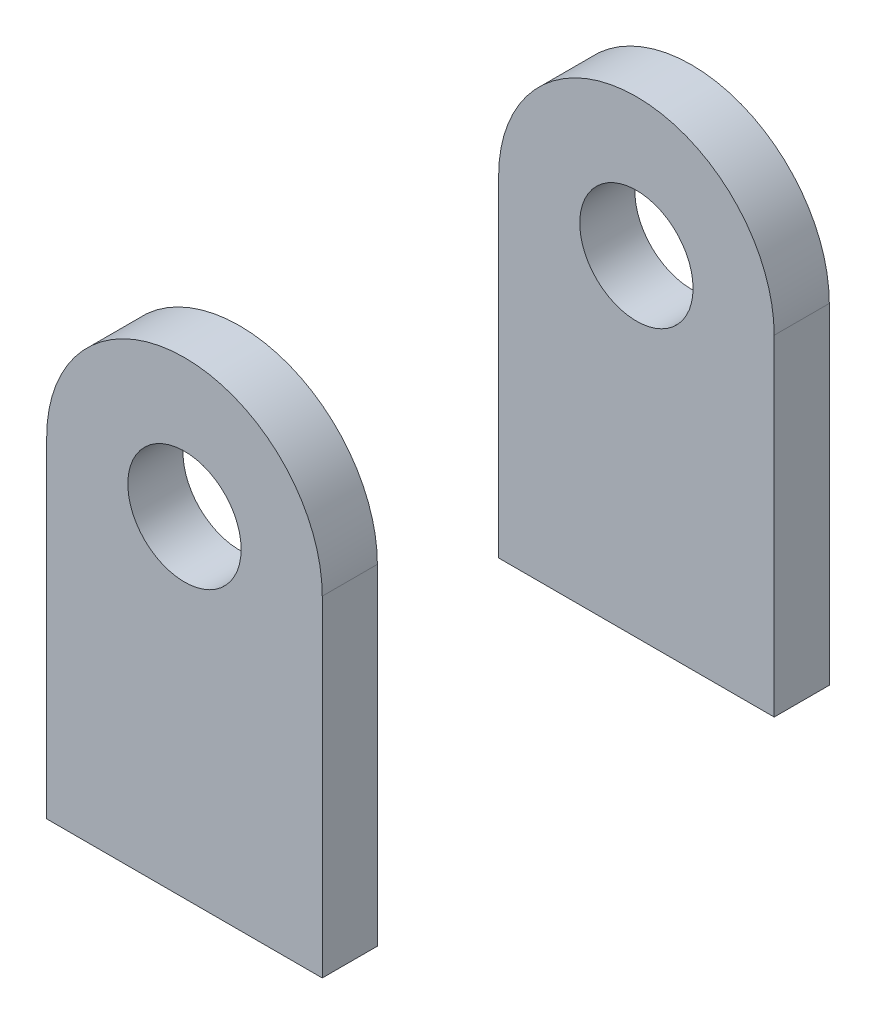
ISO-10303-21;
HEADER;
FILE_DESCRIPTION(('STEP AP214'),'2;1');
FILE_NAME('part.step','',(''),(''),'','','');
FILE_SCHEMA(('AUTOMOTIVE_DESIGN { 1 0 10303 214 1 1 1 1 }'));
ENDSEC;
DATA;
#1=APPLICATION_CONTEXT('core data for automotive mechanical design processes');
#2=APPLICATION_PROTOCOL_DEFINITION('international standard','automotive_design',2000,#1);
#3=PRODUCT_CONTEXT('',#1,'mechanical');
#4=PRODUCT('Part','Part','',(#3));
#5=PRODUCT_RELATED_PRODUCT_CATEGORY('part','',(#4));
#6=PRODUCT_DEFINITION_FORMATION('','',#4);
#7=PRODUCT_DEFINITION_CONTEXT('part definition',#1,'design');
#8=PRODUCT_DEFINITION('design','',#6,#7);
#9=PRODUCT_DEFINITION_SHAPE('','',#8);
#10=(LENGTH_UNIT() NAMED_UNIT(*) SI_UNIT(.MILLI.,.METRE.));
#11=(NAMED_UNIT(*) PLANE_ANGLE_UNIT() SI_UNIT($,.RADIAN.));
#12=(NAMED_UNIT(*) SI_UNIT($,.STERADIAN.) SOLID_ANGLE_UNIT());
#13=UNCERTAINTY_MEASURE_WITH_UNIT(LENGTH_MEASURE(1.E-05),#10,'distance_accuracy_value','');
#14=(GEOMETRIC_REPRESENTATION_CONTEXT(3) GLOBAL_UNCERTAINTY_ASSIGNED_CONTEXT((#13)) GLOBAL_UNIT_ASSIGNED_CONTEXT((#10,
#11,#12)) REPRESENTATION_CONTEXT('',''));
#15=CARTESIAN_POINT('',(0.,0.,0.));
#16=DIRECTION('',(0.,0.,1.));
#17=DIRECTION('',(1.,0.,0.));
#18=AXIS2_PLACEMENT_3D('',#15,#16,#17);
#19=CARTESIAN_POINT('',(0.,-19.05,14.605));
#20=DIRECTION('',(0.,1.,0.));
#21=DIRECTION('',(0.,0.,-1.));
#22=AXIS2_PLACEMENT_3D('',#19,#20,#21);
#23=PLANE('',#22);
#24=DIRECTION('',(-1.,0.,0.));
#25=VECTOR('',#24,1.);
#26=CARTESIAN_POINT('',(0.,-19.05,11.43));
#27=LINE('',#26,#25);
#28=CARTESIAN_POINT('',(7.9375,-19.05,11.43));
#29=VERTEX_POINT('',#28);
#30=CARTESIAN_POINT('',(-7.9375,-19.05,11.43));
#31=VERTEX_POINT('',#30);
#32=EDGE_CURVE('E123',#29,#31,#27,.T.);
#33=ORIENTED_EDGE('',*,*,#32,.F.);
#34=DIRECTION('',(0.,0.,-1.));
#35=VECTOR('',#34,1.);
#36=CARTESIAN_POINT('',(7.9375,-19.05,14.605));
#37=LINE('',#36,#35);
#38=CARTESIAN_POINT('',(7.9375,-19.05,14.605));
#39=VERTEX_POINT('',#38);
#40=EDGE_CURVE('E58',#39,#29,#37,.T.);
#41=ORIENTED_EDGE('',*,*,#40,.F.);
#42=DIRECTION('',(-1.,0.,0.));
#43=VECTOR('',#42,1.);
#44=CARTESIAN_POINT('',(0.,-19.05,14.605));
#45=LINE('',#44,#43);
#46=CARTESIAN_POINT('',(-7.9375,-19.05,14.605));
#47=VERTEX_POINT('',#46);
#48=EDGE_CURVE('E109',#39,#47,#45,.T.);
#49=ORIENTED_EDGE('',*,*,#48,.T.);
#50=DIRECTION('',(0.,0.,-1.));
#51=VECTOR('',#50,1.);
#52=CARTESIAN_POINT('',(-7.9375,-19.05,14.605));
#53=LINE('',#52,#51);
#54=EDGE_CURVE('E12',#47,#31,#53,.T.);
#55=ORIENTED_EDGE('',*,*,#54,.T.);
#56=EDGE_LOOP('',(#33,#41,#49,#55));
#57=FACE_BOUND('',#56,.T.);
#58=ADVANCED_FACE('F55',(#57),#23,.F.);
#59=CARTESIAN_POINT('',(-7.9375,0.,14.605));
#60=DIRECTION('',(1.,0.,0.));
#61=DIRECTION('',(0.,1.,0.));
#62=AXIS2_PLACEMENT_3D('',#59,#60,#61);
#63=PLANE('',#62);
#64=DIRECTION('',(0.,1.,0.));
#65=VECTOR('',#64,1.);
#66=CARTESIAN_POINT('',(-7.9375,0.,11.43));
#67=LINE('',#66,#65);
#68=CARTESIAN_POINT('',(-7.9375,0.,11.43));
#69=VERTEX_POINT('',#68);
#70=EDGE_CURVE('E96',#31,#69,#67,.T.);
#71=ORIENTED_EDGE('',*,*,#70,.F.);
#72=ORIENTED_EDGE('',*,*,#54,.F.);
#73=DIRECTION('',(0.,1.,0.));
#74=VECTOR('',#73,1.);
#75=CARTESIAN_POINT('',(-7.9375,0.,14.605));
#76=LINE('',#75,#74);
#77=CARTESIAN_POINT('',(-7.9375,0.,14.605));
#78=VERTEX_POINT('',#77);
#79=EDGE_CURVE('E73',#47,#78,#76,.T.);
#80=ORIENTED_EDGE('',*,*,#79,.T.);
#81=DIRECTION('',(0.,0.,-1.));
#82=VECTOR('',#81,1.);
#83=CARTESIAN_POINT('',(-7.9375,0.,14.605));
#84=LINE('',#83,#82);
#85=EDGE_CURVE('E64',#78,#69,#84,.T.);
#86=ORIENTED_EDGE('',*,*,#85,.T.);
#87=EDGE_LOOP('',(#71,#72,#80,#86));
#88=FACE_BOUND('',#87,.T.);
#89=ADVANCED_FACE('F132',(#88),#63,.F.);
#90=CARTESIAN_POINT('',(0.,0.,14.605));
#91=DIRECTION('',(0.,0.,-1.));
#92=DIRECTION('',(1.,0.,0.));
#93=AXIS2_PLACEMENT_3D('',#90,#91,#92);
#94=CYLINDRICAL_SURFACE('',#93,7.9375);
#95=CARTESIAN_POINT('',(0.,0.,11.43));
#96=DIRECTION('',(0.,0.,1.));
#97=DIRECTION('',(1.,0.,0.));
#98=AXIS2_PLACEMENT_3D('',#95,#96,#97);
#99=CIRCLE('',#98,7.9375);
#100=CARTESIAN_POINT('',(7.9375,0.,11.43));
#101=VERTEX_POINT('',#100);
#102=EDGE_CURVE('E90',#101,#69,#99,.T.);
#103=ORIENTED_EDGE('',*,*,#102,.T.);
#104=ORIENTED_EDGE('',*,*,#85,.F.);
#105=CARTESIAN_POINT('',(0.,0.,14.605));
#106=DIRECTION('',(0.,0.,1.));
#107=DIRECTION('',(1.,0.,0.));
#108=AXIS2_PLACEMENT_3D('',#105,#106,#107);
#109=CIRCLE('',#108,7.9375);
#110=CARTESIAN_POINT('',(7.9375,0.,14.605));
#111=VERTEX_POINT('',#110);
#112=EDGE_CURVE('E107',#111,#78,#109,.T.);
#113=ORIENTED_EDGE('',*,*,#112,.F.);
#114=DIRECTION('',(0.,0.,-1.));
#115=VECTOR('',#114,1.);
#116=CARTESIAN_POINT('',(7.9375,0.,14.605));
#117=LINE('',#116,#115);
#118=EDGE_CURVE('E112',#111,#101,#117,.T.);
#119=ORIENTED_EDGE('',*,*,#118,.T.);
#120=EDGE_LOOP('',(#103,#104,#113,#119));
#121=FACE_BOUND('',#120,.T.);
#122=ADVANCED_FACE('F115',(#121),#94,.T.);
#123=CARTESIAN_POINT('',(7.9375,0.,14.605));
#124=DIRECTION('',(-1.,0.,0.));
#125=DIRECTION('',(0.,-1.,0.));
#126=AXIS2_PLACEMENT_3D('',#123,#124,#125);
#127=PLANE('',#126);
#128=DIRECTION('',(0.,-1.,0.));
#129=VECTOR('',#128,1.);
#130=CARTESIAN_POINT('',(7.9375,0.,11.43));
#131=LINE('',#130,#129);
#132=EDGE_CURVE('E114',#101,#29,#131,.T.);
#133=ORIENTED_EDGE('',*,*,#132,.F.);
#134=ORIENTED_EDGE('',*,*,#118,.F.);
#135=DIRECTION('',(0.,-1.,0.));
#136=VECTOR('',#135,1.);
#137=CARTESIAN_POINT('',(7.9375,0.,14.605));
#138=LINE('',#137,#136);
#139=EDGE_CURVE('E103',#111,#39,#138,.T.);
#140=ORIENTED_EDGE('',*,*,#139,.T.);
#141=ORIENTED_EDGE('',*,*,#40,.T.);
#142=EDGE_LOOP('',(#133,#134,#140,#141));
#143=FACE_BOUND('',#142,.T.);
#144=ADVANCED_FACE('F113',(#143),#127,.F.);
#145=CARTESIAN_POINT('',(0.,0.,14.605));
#146=DIRECTION('',(0.,0.,-1.));
#147=DIRECTION('',(1.,0.,0.));
#148=AXIS2_PLACEMENT_3D('',#145,#146,#147);
#149=CYLINDRICAL_SURFACE('',#148,3.2639);
#150=CARTESIAN_POINT('',(0.,0.,14.605));
#151=DIRECTION('',(0.,0.,1.));
#152=DIRECTION('',(1.,0.,0.));
#153=AXIS2_PLACEMENT_3D('',#150,#151,#152);
#154=CIRCLE('',#153,3.2639);
#155=CARTESIAN_POINT('',(3.2639,0.,14.605));
#156=VERTEX_POINT('',#155);
#157=EDGE_CURVE('E117',#156,#156,#154,.T.);
#158=ORIENTED_EDGE('',*,*,#157,.T.);
#159=EDGE_LOOP('',(#158));
#160=FACE_BOUND('',#159,.T.);
#161=CARTESIAN_POINT('',(0.,0.,11.43));
#162=DIRECTION('',(0.,0.,1.));
#163=DIRECTION('',(1.,0.,0.));
#164=AXIS2_PLACEMENT_3D('',#161,#162,#163);
#165=CIRCLE('',#164,3.2639);
#166=CARTESIAN_POINT('',(3.2639,0.,11.43));
#167=VERTEX_POINT('',#166);
#168=EDGE_CURVE('E129',#167,#167,#165,.T.);
#169=ORIENTED_EDGE('',*,*,#168,.F.);
#170=EDGE_LOOP('',(#169));
#171=FACE_BOUND('',#170,.T.);
#172=ADVANCED_FACE('F148',(#160,#171),#149,.F.);
#173=CARTESIAN_POINT('',(0.,0.,14.605));
#174=DIRECTION('',(0.,0.,-1.));
#175=DIRECTION('',(1.,0.,0.));
#176=AXIS2_PLACEMENT_3D('',#173,#174,#175);
#177=PLANE('',#176);
#178=ORIENTED_EDGE('',*,*,#48,.F.);
#179=ORIENTED_EDGE('',*,*,#139,.F.);
#180=ORIENTED_EDGE('',*,*,#112,.T.);
#181=ORIENTED_EDGE('',*,*,#79,.F.);
#182=EDGE_LOOP('',(#178,#179,#180,#181));
#183=FACE_BOUND('',#182,.T.);
#184=ORIENTED_EDGE('',*,*,#157,.F.);
#185=EDGE_LOOP('',(#184));
#186=FACE_BOUND('',#185,.T.);
#187=ADVANCED_FACE('F104',(#183,#186),#177,.F.);
#188=CARTESIAN_POINT('',(0.,0.,11.43));
#189=DIRECTION('',(0.,0.,-1.));
#190=DIRECTION('',(1.,0.,0.));
#191=AXIS2_PLACEMENT_3D('',#188,#189,#190);
#192=PLANE('',#191);
#193=ORIENTED_EDGE('',*,*,#32,.T.);
#194=ORIENTED_EDGE('',*,*,#70,.T.);
#195=ORIENTED_EDGE('',*,*,#102,.F.);
#196=ORIENTED_EDGE('',*,*,#132,.T.);
#197=EDGE_LOOP('',(#193,#194,#195,#196));
#198=FACE_BOUND('',#197,.T.);
#199=ORIENTED_EDGE('',*,*,#168,.T.);
#200=EDGE_LOOP('',(#199));
#201=FACE_BOUND('',#200,.T.);
#202=ADVANCED_FACE('F134',(#198,#201),#192,.T.);
#203=CLOSED_SHELL('',(#58,#89,#122,#144,#172,#187,#202));
#204=MANIFOLD_SOLID_BREP('B2',#203);
#205=CARTESIAN_POINT('',(0.,-19.05,-14.605));
#206=DIRECTION('',(0.,-1.,0.));
#207=DIRECTION('',(0.,0.,1.));
#208=AXIS2_PLACEMENT_3D('',#205,#206,#207);
#209=PLANE('',#208);
#210=DIRECTION('',(-1.,0.,0.));
#211=VECTOR('',#210,1.);
#212=CARTESIAN_POINT('',(0.,-19.05,-11.43));
#213=LINE('',#212,#211);
#214=CARTESIAN_POINT('',(7.9375,-19.05,-11.43));
#215=VERTEX_POINT('',#214);
#216=CARTESIAN_POINT('',(-7.9375,-19.05,-11.43));
#217=VERTEX_POINT('',#216);
#218=EDGE_CURVE('E280',#215,#217,#213,.T.);
#219=ORIENTED_EDGE('',*,*,#218,.T.);
#220=DIRECTION('',(0.,0.,1.));
#221=VECTOR('',#220,1.);
#222=CARTESIAN_POINT('',(-7.9375,-19.05,-14.605));
#223=LINE('',#222,#221);
#224=CARTESIAN_POINT('',(-7.9375,-19.05,-14.605));
#225=VERTEX_POINT('',#224);
#226=EDGE_CURVE('E279',#225,#217,#223,.T.);
#227=ORIENTED_EDGE('',*,*,#226,.F.);
#228=DIRECTION('',(-1.,0.,0.));
#229=VECTOR('',#228,1.);
#230=CARTESIAN_POINT('',(0.,-19.05,-14.605));
#231=LINE('',#230,#229);
#232=CARTESIAN_POINT('',(7.9375,-19.05,-14.605));
#233=VERTEX_POINT('',#232);
#234=EDGE_CURVE('E270',#233,#225,#231,.T.);
#235=ORIENTED_EDGE('',*,*,#234,.F.);
#236=DIRECTION('',(0.,0.,1.));
#237=VECTOR('',#236,1.);
#238=CARTESIAN_POINT('',(7.9375,-19.05,-14.605));
#239=LINE('',#238,#237);
#240=EDGE_CURVE('E53',#233,#215,#239,.T.);
#241=ORIENTED_EDGE('',*,*,#240,.T.);
#242=EDGE_LOOP('',(#219,#227,#235,#241));
#243=FACE_BOUND('',#242,.T.);
#244=ADVANCED_FACE('F212',(#243),#209,.T.);
#245=CARTESIAN_POINT('',(7.9375,0.,-14.605));
#246=DIRECTION('',(1.,0.,0.));
#247=DIRECTION('',(0.,1.,0.));
#248=AXIS2_PLACEMENT_3D('',#245,#246,#247);
#249=PLANE('',#248);
#250=DIRECTION('',(0.,-1.,0.));
#251=VECTOR('',#250,1.);
#252=CARTESIAN_POINT('',(7.9375,0.,-11.43));
#253=LINE('',#252,#251);
#254=CARTESIAN_POINT('',(7.9375,0.,-11.43));
#255=VERTEX_POINT('',#254);
#256=EDGE_CURVE('E283',#255,#215,#253,.T.);
#257=ORIENTED_EDGE('',*,*,#256,.T.);
#258=ORIENTED_EDGE('',*,*,#240,.F.);
#259=DIRECTION('',(0.,-1.,0.));
#260=VECTOR('',#259,1.);
#261=CARTESIAN_POINT('',(7.9375,0.,-14.605));
#262=LINE('',#261,#260);
#263=CARTESIAN_POINT('',(7.9375,0.,-14.605));
#264=VERTEX_POINT('',#263);
#265=EDGE_CURVE('E253',#264,#233,#262,.T.);
#266=ORIENTED_EDGE('',*,*,#265,.F.);
#267=DIRECTION('',(0.,0.,1.));
#268=VECTOR('',#267,1.);
#269=CARTESIAN_POINT('',(7.9375,0.,-14.605));
#270=LINE('',#269,#268);
#271=EDGE_CURVE('E220',#264,#255,#270,.T.);
#272=ORIENTED_EDGE('',*,*,#271,.T.);
#273=EDGE_LOOP('',(#257,#258,#266,#272));
#274=FACE_BOUND('',#273,.T.);
#275=ADVANCED_FACE('F268',(#274),#249,.T.);
#276=CARTESIAN_POINT('',(0.,0.,-14.605));
#277=DIRECTION('',(0.,0.,1.));
#278=DIRECTION('',(-1.,0.,0.));
#279=AXIS2_PLACEMENT_3D('',#276,#277,#278);
#280=CYLINDRICAL_SURFACE('',#279,7.9375);
#281=CARTESIAN_POINT('',(0.,0.,-11.43));
#282=DIRECTION('',(0.,0.,1.));
#283=DIRECTION('',(1.,0.,0.));
#284=AXIS2_PLACEMENT_3D('',#281,#282,#283);
#285=CIRCLE('',#284,7.9375);
#286=CARTESIAN_POINT('',(-7.9375,0.,-11.43));
#287=VERTEX_POINT('',#286);
#288=EDGE_CURVE('E264',#255,#287,#285,.T.);
#289=ORIENTED_EDGE('',*,*,#288,.F.);
#290=ORIENTED_EDGE('',*,*,#271,.F.);
#291=CARTESIAN_POINT('',(0.,0.,-14.605));
#292=DIRECTION('',(0.,0.,1.));
#293=DIRECTION('',(1.,0.,0.));
#294=AXIS2_PLACEMENT_3D('',#291,#292,#293);
#295=CIRCLE('',#294,7.9375);
#296=CARTESIAN_POINT('',(-7.9375,0.,-14.605));
#297=VERTEX_POINT('',#296);
#298=EDGE_CURVE('E256',#264,#297,#295,.T.);
#299=ORIENTED_EDGE('',*,*,#298,.T.);
#300=DIRECTION('',(0.,0.,1.));
#301=VECTOR('',#300,1.);
#302=CARTESIAN_POINT('',(-7.9375,0.,-14.605));
#303=LINE('',#302,#301);
#304=EDGE_CURVE('E267',#297,#287,#303,.T.);
#305=ORIENTED_EDGE('',*,*,#304,.T.);
#306=EDGE_LOOP('',(#289,#290,#299,#305));
#307=FACE_BOUND('',#306,.T.);
#308=ADVANCED_FACE('F263',(#307),#280,.T.);
#309=CARTESIAN_POINT('',(-7.9375,0.,-14.605));
#310=DIRECTION('',(-1.,0.,0.));
#311=DIRECTION('',(0.,-1.,0.));
#312=AXIS2_PLACEMENT_3D('',#309,#310,#311);
#313=PLANE('',#312);
#314=DIRECTION('',(0.,1.,0.));
#315=VECTOR('',#314,1.);
#316=CARTESIAN_POINT('',(-7.9375,0.,-11.43));
#317=LINE('',#316,#315);
#318=EDGE_CURVE('E242',#217,#287,#317,.T.);
#319=ORIENTED_EDGE('',*,*,#318,.T.);
#320=ORIENTED_EDGE('',*,*,#304,.F.);
#321=DIRECTION('',(0.,1.,0.));
#322=VECTOR('',#321,1.);
#323=CARTESIAN_POINT('',(-7.9375,0.,-14.605));
#324=LINE('',#323,#322);
#325=EDGE_CURVE('E228',#225,#297,#324,.T.);
#326=ORIENTED_EDGE('',*,*,#325,.F.);
#327=ORIENTED_EDGE('',*,*,#226,.T.);
#328=EDGE_LOOP('',(#319,#320,#326,#327));
#329=FACE_BOUND('',#328,.T.);
#330=ADVANCED_FACE('F294',(#329),#313,.T.);
#331=CARTESIAN_POINT('',(0.,0.,-14.605));
#332=DIRECTION('',(0.,0.,1.));
#333=DIRECTION('',(-1.,0.,0.));
#334=AXIS2_PLACEMENT_3D('',#331,#332,#333);
#335=CYLINDRICAL_SURFACE('',#334,3.2639);
#336=CARTESIAN_POINT('',(0.,0.,-14.605));
#337=DIRECTION('',(0.,0.,1.));
#338=DIRECTION('',(1.,0.,0.));
#339=AXIS2_PLACEMENT_3D('',#336,#337,#338);
#340=CIRCLE('',#339,3.2639);
#341=CARTESIAN_POINT('',(3.2639,0.,-14.605));
#342=VERTEX_POINT('',#341);
#343=EDGE_CURVE('E276',#342,#342,#340,.T.);
#344=ORIENTED_EDGE('',*,*,#343,.F.);
#345=EDGE_LOOP('',(#344));
#346=FACE_BOUND('',#345,.T.);
#347=CARTESIAN_POINT('',(0.,0.,-11.43));
#348=DIRECTION('',(0.,0.,1.));
#349=DIRECTION('',(1.,0.,0.));
#350=AXIS2_PLACEMENT_3D('',#347,#348,#349);
#351=CIRCLE('',#350,3.2639);
#352=CARTESIAN_POINT('',(3.2639,0.,-11.43));
#353=VERTEX_POINT('',#352);
#354=EDGE_CURVE('E272',#353,#353,#351,.T.);
#355=ORIENTED_EDGE('',*,*,#354,.T.);
#356=EDGE_LOOP('',(#355));
#357=FACE_BOUND('',#356,.T.);
#358=ADVANCED_FACE('F296',(#346,#357),#335,.F.);
#359=CARTESIAN_POINT('',(0.,0.,-14.605));
#360=DIRECTION('',(0.,0.,-1.));
#361=DIRECTION('',(1.,0.,0.));
#362=AXIS2_PLACEMENT_3D('',#359,#360,#361);
#363=PLANE('',#362);
#364=ORIENTED_EDGE('',*,*,#234,.T.);
#365=ORIENTED_EDGE('',*,*,#325,.T.);
#366=ORIENTED_EDGE('',*,*,#298,.F.);
#367=ORIENTED_EDGE('',*,*,#265,.T.);
#368=EDGE_LOOP('',(#364,#365,#366,#367));
#369=FACE_BOUND('',#368,.T.);
#370=ORIENTED_EDGE('',*,*,#343,.T.);
#371=EDGE_LOOP('',(#370));
#372=FACE_BOUND('',#371,.T.);
#373=ADVANCED_FACE('F258',(#369,#372),#363,.T.);
#374=CARTESIAN_POINT('',(0.,0.,-11.43));
#375=DIRECTION('',(0.,0.,-1.));
#376=DIRECTION('',(1.,0.,0.));
#377=AXIS2_PLACEMENT_3D('',#374,#375,#376);
#378=PLANE('',#377);
#379=ORIENTED_EDGE('',*,*,#218,.F.);
#380=ORIENTED_EDGE('',*,*,#256,.F.);
#381=ORIENTED_EDGE('',*,*,#288,.T.);
#382=ORIENTED_EDGE('',*,*,#318,.F.);
#383=EDGE_LOOP('',(#379,#380,#381,#382));
#384=FACE_BOUND('',#383,.T.);
#385=ORIENTED_EDGE('',*,*,#354,.F.);
#386=EDGE_LOOP('',(#385));
#387=FACE_BOUND('',#386,.T.);
#388=ADVANCED_FACE('F290',(#384,#387),#378,.F.);
#389=CLOSED_SHELL('',(#244,#275,#308,#330,#358,#373,#388));
#390=MANIFOLD_SOLID_BREP('B6',#389);
#391=ADVANCED_BREP_SHAPE_REPRESENTATION('',(#18,#204,#390),#14);
#392=SHAPE_DEFINITION_REPRESENTATION(#9,#391);
ENDSEC;
END-ISO-10303-21;
